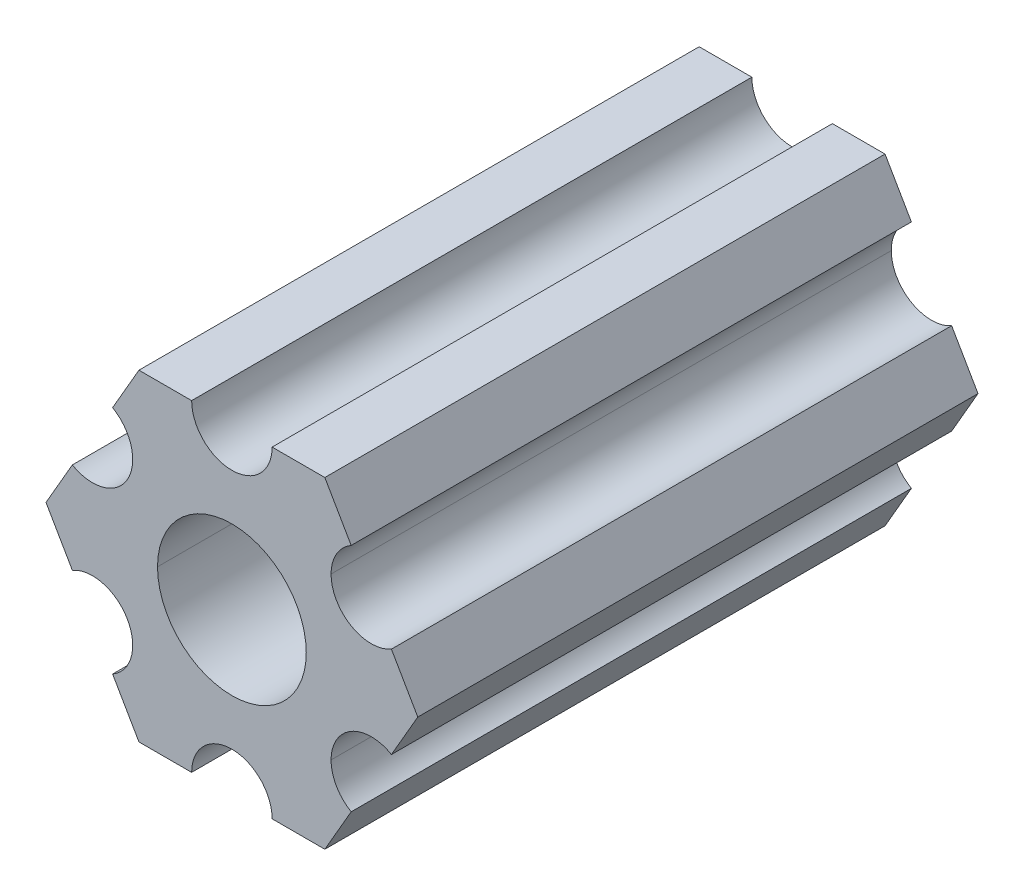
ISO-10303-21;
HEADER;
FILE_DESCRIPTION(('STEP AP214'),'2;1');
FILE_NAME('part.step','',(''),(''),'','','');
FILE_SCHEMA(('AUTOMOTIVE_DESIGN { 1 0 10303 214 1 1 1 1 }'));
ENDSEC;
DATA;
#1=APPLICATION_CONTEXT('core data for automotive mechanical design processes');
#2=APPLICATION_PROTOCOL_DEFINITION('international standard','automotive_design',2000,#1);
#3=PRODUCT_CONTEXT('',#1,'mechanical');
#4=PRODUCT('Part','Part','',(#3));
#5=PRODUCT_RELATED_PRODUCT_CATEGORY('part','',(#4));
#6=PRODUCT_DEFINITION_FORMATION('','',#4);
#7=PRODUCT_DEFINITION_CONTEXT('part definition',#1,'design');
#8=PRODUCT_DEFINITION('design','',#6,#7);
#9=PRODUCT_DEFINITION_SHAPE('','',#8);
#10=(LENGTH_UNIT() NAMED_UNIT(*) SI_UNIT(.MILLI.,.METRE.));
#11=(NAMED_UNIT(*) PLANE_ANGLE_UNIT() SI_UNIT($,.RADIAN.));
#12=(NAMED_UNIT(*) SI_UNIT($,.STERADIAN.) SOLID_ANGLE_UNIT());
#13=UNCERTAINTY_MEASURE_WITH_UNIT(LENGTH_MEASURE(1.E-05),#10,'distance_accuracy_value','');
#14=(GEOMETRIC_REPRESENTATION_CONTEXT(3) GLOBAL_UNCERTAINTY_ASSIGNED_CONTEXT((#13)) GLOBAL_UNIT_ASSIGNED_CONTEXT((#10,
#11,#12)) REPRESENTATION_CONTEXT('',''));
#15=CARTESIAN_POINT('',(0.,0.,0.));
#16=DIRECTION('',(0.,0.,1.));
#17=DIRECTION('',(1.,0.,0.));
#18=AXIS2_PLACEMENT_3D('',#15,#16,#17);
#19=CARTESIAN_POINT('',(6.29301142309098,-1.80018429024546,85.725));
#20=DIRECTION('',(-0.866025434075723,0.499999947533953,0.));
#21=DIRECTION('',(0.,0.,1.));
#22=AXIS2_PLACEMENT_3D('',#19,#20,#21);
#23=PLANE('',#22);
#24=DIRECTION('',(0.499999947533953,0.866025434075723,0.));
#25=VECTOR('',#24,1.);
#26=CARTESIAN_POINT('',(6.29301142309098,-1.80018429024546,22.098));
#27=LINE('',#26,#25);
#28=CARTESIAN_POINT('',(6.29301142309098,-1.80018429024546,22.098));
#29=VERTEX_POINT('',#28);
#30=CARTESIAN_POINT('',(7.33234841870826,4.44212519415746E-07,22.098));
#31=VERTEX_POINT('',#30);
#32=EDGE_CURVE('E398',#29,#31,#27,.T.);
#33=ORIENTED_EDGE('',*,*,#32,.F.);
#34=DIRECTION('',(0.,0.,-1.));
#35=VECTOR('',#34,1.);
#36=CARTESIAN_POINT('',(6.29301142309098,-1.80018429024546,85.725));
#37=LINE('',#36,#35);
#38=CARTESIAN_POINT('',(6.29301142309098,-1.80018429024546,0.));
#39=VERTEX_POINT('',#38);
#40=EDGE_CURVE('E270',#29,#39,#37,.T.);
#41=ORIENTED_EDGE('',*,*,#40,.T.);
#42=DIRECTION('',(0.499999947533953,0.866025434075723,0.));
#43=VECTOR('',#42,1.);
#44=CARTESIAN_POINT('',(6.29301142309098,-1.80018429024546,0.));
#45=LINE('',#44,#43);
#46=CARTESIAN_POINT('',(7.33234841870826,4.44212518961143E-07,0.));
#47=VERTEX_POINT('',#46);
#48=EDGE_CURVE('E292',#39,#47,#45,.T.);
#49=ORIENTED_EDGE('',*,*,#48,.T.);
#50=DIRECTION('',(0.,0.,1.));
#51=VECTOR('',#50,1.);
#52=CARTESIAN_POINT('',(7.33234841870827,4.44212519169686E-07,85.725));
#53=LINE('',#52,#51);
#54=EDGE_CURVE('E65',#47,#31,#53,.T.);
#55=ORIENTED_EDGE('',*,*,#54,.T.);
#56=EDGE_LOOP('',(#33,#41,#49,#55));
#57=FACE_BOUND('',#56,.T.);
#58=ADVANCED_FACE('F57',(#57),#23,.F.);
#59=CARTESIAN_POINT('',(7.33234841870827,4.44212519169686E-07,85.725));
#60=DIRECTION('',(-0.866025373493145,-0.500000052466057,0.));
#61=DIRECTION('',(-0.500000052466057,0.866025373493145,0.));
#62=AXIS2_PLACEMENT_3D('',#59,#60,#61);
#63=PLANE('',#62);
#64=DIRECTION('',(-0.500000052466057,0.866025373493145,0.));
#65=VECTOR('',#64,1.);
#66=CARTESIAN_POINT('',(7.33234841870827,4.44212519169686E-07,22.098));
#67=LINE('',#66,#65);
#68=CARTESIAN_POINT('',(6.29301120497139,1.80018505273895,22.098));
#69=VERTEX_POINT('',#68);
#70=EDGE_CURVE('E406',#31,#69,#67,.T.);
#71=ORIENTED_EDGE('',*,*,#70,.F.);
#72=ORIENTED_EDGE('',*,*,#54,.F.);
#73=DIRECTION('',(-0.500000052466057,0.866025373493145,0.));
#74=VECTOR('',#73,1.);
#75=CARTESIAN_POINT('',(7.33234841870827,4.44212519198906E-07,0.));
#76=LINE('',#75,#74);
#77=CARTESIAN_POINT('',(6.29301120497139,1.80018505273894,0.));
#78=VERTEX_POINT('',#77);
#79=EDGE_CURVE('E288',#47,#78,#76,.T.);
#80=ORIENTED_EDGE('',*,*,#79,.T.);
#81=DIRECTION('',(0.,0.,1.));
#82=VECTOR('',#81,1.);
#83=CARTESIAN_POINT('',(6.29301120497139,1.80018505273894,85.725));
#84=LINE('',#83,#82);
#85=EDGE_CURVE('E390',#78,#69,#84,.T.);
#86=ORIENTED_EDGE('',*,*,#85,.T.);
#87=EDGE_LOOP('',(#71,#72,#80,#86));
#88=FACE_BOUND('',#87,.T.);
#89=ADVANCED_FACE('F404',(#88),#63,.F.);
#90=CARTESIAN_POINT('',(5.49926112168156,3.17500033315934,85.725));
#91=DIRECTION('',(0.,0.,-1.));
#92=DIRECTION('',(-1.,0.,0.));
#93=AXIS2_PLACEMENT_3D('',#90,#91,#92);
#94=CYLINDRICAL_SURFACE('',#93,1.5875);
#95=CARTESIAN_POINT('',(5.49926112168156,3.17500033315934,22.098));
#96=DIRECTION('',(0.,0.,1.));
#97=DIRECTION('',(1.,0.,0.));
#98=AXIS2_PLACEMENT_3D('',#95,#96,#97);
#99=CIRCLE('',#98,1.5875);
#100=CARTESIAN_POINT('',(3.91176112168156,3.17500033315934,22.098));
#101=VERTEX_POINT('',#100);
#102=EDGE_CURVE('E409',#69,#101,#99,.F.);
#103=ORIENTED_EDGE('',*,*,#102,.F.);
#104=ORIENTED_EDGE('',*,*,#85,.F.);
#105=CARTESIAN_POINT('',(5.49926112168156,3.17500033315934,0.));
#106=DIRECTION('',(0.,0.,-1.));
#107=DIRECTION('',(-1.,0.,0.));
#108=AXIS2_PLACEMENT_3D('',#105,#106,#107);
#109=CIRCLE('',#108,1.5875);
#110=CARTESIAN_POINT('',(3.91176112168156,3.17500033315934,0.));
#111=VERTEX_POINT('',#110);
#112=EDGE_CURVE('E262',#78,#111,#109,.T.);
#113=ORIENTED_EDGE('',*,*,#112,.T.);
#114=DIRECTION('',(0.,0.,-1.));
#115=VECTOR('',#114,1.);
#116=CARTESIAN_POINT('',(3.91176112168156,3.17500033315934,85.725));
#117=LINE('',#116,#115);
#118=EDGE_CURVE('E273',#101,#111,#117,.T.);
#119=ORIENTED_EDGE('',*,*,#118,.F.);
#120=EDGE_LOOP('',(#103,#104,#113,#119));
#121=FACE_BOUND('',#120,.T.);
#122=ADVANCED_FACE('F869',(#121),#94,.F.);
#123=CARTESIAN_POINT('',(4.70551103839172,4.54981561357972,85.725));
#124=DIRECTION('',(-0.866025373493151,-0.500000052466046,0.));
#125=DIRECTION('',(-0.500000052466046,0.866025373493151,0.));
#126=AXIS2_PLACEMENT_3D('',#123,#124,#125);
#127=PLANE('',#126);
#128=DIRECTION('',(-0.500000052466046,0.866025373493151,0.));
#129=VECTOR('',#128,1.);
#130=CARTESIAN_POINT('',(4.70551103839172,4.54981561357972,22.098));
#131=LINE('',#130,#129);
#132=CARTESIAN_POINT('',(4.70551103839172,4.54981561357972,22.098));
#133=VERTEX_POINT('',#132);
#134=CARTESIAN_POINT('',(3.66617382465481,6.35000022210627,22.098));
#135=VERTEX_POINT('',#134);
#136=EDGE_CURVE('E479',#133,#135,#131,.T.);
#137=ORIENTED_EDGE('',*,*,#136,.F.);
#138=DIRECTION('',(0.,0.,1.));
#139=VECTOR('',#138,1.);
#140=CARTESIAN_POINT('',(4.70551103839172,4.54981561357972,85.725));
#141=LINE('',#140,#139);
#142=CARTESIAN_POINT('',(4.70551103839172,4.54981561357972,0.));
#143=VERTEX_POINT('',#142);
#144=EDGE_CURVE('E281',#143,#133,#141,.T.);
#145=ORIENTED_EDGE('',*,*,#144,.F.);
#146=DIRECTION('',(-0.500000052466046,0.866025373493151,0.));
#147=VECTOR('',#146,1.);
#148=CARTESIAN_POINT('',(4.70551103839172,4.54981561357972,0.));
#149=LINE('',#148,#147);
#150=CARTESIAN_POINT('',(3.66617382465481,6.35000022210627,0.));
#151=VERTEX_POINT('',#150);
#152=EDGE_CURVE('E259',#143,#151,#149,.T.);
#153=ORIENTED_EDGE('',*,*,#152,.T.);
#154=DIRECTION('',(0.,0.,1.));
#155=VECTOR('',#154,1.);
#156=CARTESIAN_POINT('',(3.66617382465481,6.35000022210627,85.725));
#157=LINE('',#156,#155);
#158=EDGE_CURVE('E386',#151,#135,#157,.T.);
#159=ORIENTED_EDGE('',*,*,#158,.T.);
#160=EDGE_LOOP('',(#137,#145,#153,#159));
#161=FACE_BOUND('',#160,.T.);
#162=ADVANCED_FACE('F491',(#161),#127,.F.);
#163=CARTESIAN_POINT('',(3.66617382465481,6.35000022210627,85.725));
#164=DIRECTION('',(6.05825850611185E-08,-1.,0.));
#165=DIRECTION('',(0.,0.,-1.));
#166=AXIS2_PLACEMENT_3D('',#163,#164,#165);
#167=PLANE('',#166);
#168=DIRECTION('',(-0.999999999999998,-6.05825850611184E-08,0.));
#169=VECTOR('',#168,1.);
#170=CARTESIAN_POINT('',(3.66617382465481,6.35000022210627,22.098));
#171=LINE('',#170,#169);
#172=CARTESIAN_POINT('',(1.58749961530074,6.35,22.098));
#173=VERTEX_POINT('',#172);
#174=EDGE_CURVE('E476',#135,#173,#171,.T.);
#175=ORIENTED_EDGE('',*,*,#174,.F.);
#176=ORIENTED_EDGE('',*,*,#158,.F.);
#177=DIRECTION('',(-1.,0.,0.));
#178=VECTOR('',#177,1.);
#179=CARTESIAN_POINT('',(5.49926112168156,6.35000022210627,0.));
#180=LINE('',#179,#178);
#181=CARTESIAN_POINT('',(1.58749961530073,6.35000015914054,0.));
#182=VERTEX_POINT('',#181);
#183=EDGE_CURVE('E263',#151,#182,#180,.T.);
#184=ORIENTED_EDGE('',*,*,#183,.T.);
#185=DIRECTION('',(0.,0.,1.));
#186=VECTOR('',#185,1.);
#187=CARTESIAN_POINT('',(1.58749961530074,6.35000009617482,85.725));
#188=LINE('',#187,#186);
#189=EDGE_CURVE('E303',#182,#173,#188,.T.);
#190=ORIENTED_EDGE('',*,*,#189,.T.);
#191=EDGE_LOOP('',(#175,#176,#184,#190));
#192=FACE_BOUND('',#191,.T.);
#193=ADVANCED_FACE('F498',(#192),#167,.F.);
#194=CARTESIAN_POINT('',(-3.84699260060323E-07,6.35,85.725));
#195=DIRECTION('',(0.,0.,-1.));
#196=DIRECTION('',(-1.,0.,0.));
#197=AXIS2_PLACEMENT_3D('',#194,#195,#196);
#198=CYLINDRICAL_SURFACE('',#197,1.5875);
#199=CARTESIAN_POINT('',(-3.84699260060323E-07,6.35,22.098));
#200=DIRECTION('',(0.,0.,1.));
#201=DIRECTION('',(1.,0.,0.));
#202=AXIS2_PLACEMENT_3D('',#199,#200,#201);
#203=CIRCLE('',#202,1.5875);
#204=CARTESIAN_POINT('',(-1.58750038469926,6.34999990382518,22.098));
#205=VERTEX_POINT('',#204);
#206=EDGE_CURVE('E473',#173,#205,#203,.F.);
#207=ORIENTED_EDGE('',*,*,#206,.F.);
#208=ORIENTED_EDGE('',*,*,#189,.F.);
#209=CARTESIAN_POINT('',(-3.84699260060323E-07,6.35,0.));
#210=DIRECTION('',(0.,0.,-1.));
#211=DIRECTION('',(-1.,0.,0.));
#212=AXIS2_PLACEMENT_3D('',#209,#210,#211);
#213=CIRCLE('',#212,1.5875);
#214=CARTESIAN_POINT('',(-1.58750038469926,6.34999990382519,0.));
#215=VERTEX_POINT('',#214);
#216=EDGE_CURVE('E329',#182,#215,#213,.T.);
#217=ORIENTED_EDGE('',*,*,#216,.T.);
#218=DIRECTION('',(0.,0.,1.));
#219=VECTOR('',#218,1.);
#220=CARTESIAN_POINT('',(-1.58750038469926,6.34999990382518,85.725));
#221=LINE('',#220,#219);
#222=EDGE_CURVE('E299',#215,#205,#221,.T.);
#223=ORIENTED_EDGE('',*,*,#222,.T.);
#224=EDGE_LOOP('',(#207,#208,#217,#223));
#225=FACE_BOUND('',#224,.T.);
#226=ADVANCED_FACE('F502',(#225),#198,.F.);
#227=CARTESIAN_POINT('',(-1.58750038469926,6.34999990382518,85.725));
#228=DIRECTION('',(6.05825963273174E-08,-1.,0.));
#229=DIRECTION('',(0.,0.,-1.));
#230=AXIS2_PLACEMENT_3D('',#227,#228,#229);
#231=PLANE('',#230);
#232=DIRECTION('',(-0.999999999999998,-6.05825963273173E-08,0.));
#233=VECTOR('',#232,1.);
#234=CARTESIAN_POINT('',(-1.58750038469926,6.34999990382518,22.098));
#235=LINE('',#234,#233);
#236=CARTESIAN_POINT('',(-3.66617454558244,6.34999986184803,22.098));
#237=VERTEX_POINT('',#236);
#238=EDGE_CURVE('E470',#205,#237,#235,.T.);
#239=ORIENTED_EDGE('',*,*,#238,.F.);
#240=ORIENTED_EDGE('',*,*,#222,.F.);
#241=DIRECTION('',(-1.,0.,0.));
#242=VECTOR('',#241,1.);
#243=CARTESIAN_POINT('',(5.49926112168156,6.34999990382519,0.));
#244=LINE('',#243,#242);
#245=CARTESIAN_POINT('',(-3.66617454558244,6.34999986184803,0.));
#246=VERTEX_POINT('',#245);
#247=EDGE_CURVE('E333',#215,#246,#244,.T.);
#248=ORIENTED_EDGE('',*,*,#247,.T.);
#249=DIRECTION('',(0.,0.,1.));
#250=VECTOR('',#249,1.);
#251=CARTESIAN_POINT('',(-3.66617459405349,6.3499997778937,85.725));
#252=LINE('',#251,#250);
#253=EDGE_CURVE('E286',#246,#237,#252,.T.);
#254=ORIENTED_EDGE('',*,*,#253,.T.);
#255=EDGE_LOOP('',(#239,#240,#248,#254));
#256=FACE_BOUND('',#255,.T.);
#257=ADVANCED_FACE('F504',(#256),#231,.F.);
#258=CARTESIAN_POINT('',(-3.66617459405349,6.3499997778937,85.725));
#259=DIRECTION('',(0.866025434075729,-0.499999947533942,0.));
#260=DIRECTION('',(0.,0.,-1.));
#261=AXIS2_PLACEMENT_3D('',#258,#259,#260);
#262=PLANE('',#261);
#263=DIRECTION('',(-0.499999947533942,-0.866025434075729,0.));
#264=VECTOR('',#263,1.);
#265=CARTESIAN_POINT('',(-3.66617459405349,6.3499997778937,22.098));
#266=LINE('',#265,#264);
#267=CARTESIAN_POINT('',(-4.70551158967065,4.54981504343587,22.098));
#268=VERTEX_POINT('',#267);
#269=EDGE_CURVE('E467',#237,#268,#266,.T.);
#270=ORIENTED_EDGE('',*,*,#269,.F.);
#271=ORIENTED_EDGE('',*,*,#253,.F.);
#272=DIRECTION('',(-0.499999947533943,-0.866025434075729,0.));
#273=VECTOR('',#272,1.);
#274=CARTESIAN_POINT('',(-3.66617459405349,6.3499997778937,0.));
#275=LINE('',#274,#273);
#276=CARTESIAN_POINT('',(-4.70551158967065,4.54981504343587,0.));
#277=VERTEX_POINT('',#276);
#278=EDGE_CURVE('E345',#246,#277,#275,.T.);
#279=ORIENTED_EDGE('',*,*,#278,.T.);
#280=DIRECTION('',(0.,0.,1.));
#281=VECTOR('',#280,1.);
#282=CARTESIAN_POINT('',(-4.70551158967065,4.54981504343587,85.725));
#283=LINE('',#282,#281);
#284=EDGE_CURVE('E282',#277,#268,#283,.T.);
#285=ORIENTED_EDGE('',*,*,#284,.T.);
#286=EDGE_LOOP('',(#270,#271,#279,#285));
#287=FACE_BOUND('',#286,.T.);
#288=ADVANCED_FACE('F509',(#287),#262,.F.);
#289=CARTESIAN_POINT('',(-5.49926150638082,3.17499966684067,85.725));
#290=DIRECTION('',(0.,0.,-1.));
#291=DIRECTION('',(-1.,0.,0.));
#292=AXIS2_PLACEMENT_3D('',#289,#290,#291);
#293=CYLINDRICAL_SURFACE('',#292,1.5875);
#294=CARTESIAN_POINT('',(-5.49926150638082,3.17499966684067,22.098));
#295=DIRECTION('',(0.,0.,1.));
#296=DIRECTION('',(1.,0.,0.));
#297=AXIS2_PLACEMENT_3D('',#294,#295,#296);
#298=CIRCLE('',#297,1.5875);
#299=CARTESIAN_POINT('',(-6.29301142309098,1.80018429024547,22.098));
#300=VERTEX_POINT('',#299);
#301=EDGE_CURVE('E464',#268,#300,#298,.F.);
#302=ORIENTED_EDGE('',*,*,#301,.F.);
#303=ORIENTED_EDGE('',*,*,#284,.F.);
#304=CARTESIAN_POINT('',(-5.49926150638082,3.17499966684067,0.));
#305=DIRECTION('',(0.,0.,-1.));
#306=DIRECTION('',(-1.,0.,0.));
#307=AXIS2_PLACEMENT_3D('',#304,#305,#306);
#308=CIRCLE('',#307,1.5875);
#309=CARTESIAN_POINT('',(-6.29301142309098,1.80018429024547,0.));
#310=VERTEX_POINT('',#309);
#311=EDGE_CURVE('E341',#277,#310,#308,.T.);
#312=ORIENTED_EDGE('',*,*,#311,.T.);
#313=DIRECTION('',(0.,0.,1.));
#314=VECTOR('',#313,1.);
#315=CARTESIAN_POINT('',(-6.29301142309098,1.80018429024547,85.725));
#316=LINE('',#315,#314);
#317=EDGE_CURVE('E287',#310,#300,#316,.T.);
#318=ORIENTED_EDGE('',*,*,#317,.T.);
#319=EDGE_LOOP('',(#302,#303,#312,#318));
#320=FACE_BOUND('',#319,.T.);
#321=ADVANCED_FACE('F512',(#320),#293,.F.);
#322=CARTESIAN_POINT('',(-6.29301142309098,1.80018429024547,85.725));
#323=DIRECTION('',(0.866025434075724,-0.499999947533952,0.));
#324=DIRECTION('',(0.,0.,-1.));
#325=AXIS2_PLACEMENT_3D('',#322,#323,#324);
#326=PLANE('',#325);
#327=DIRECTION('',(-0.499999947533952,-0.866025434075724,0.));
#328=VECTOR('',#327,1.);
#329=CARTESIAN_POINT('',(-6.29301142309098,1.80018429024547,22.098));
#330=LINE('',#329,#328);
#331=CARTESIAN_POINT('',(-7.33234841870827,-4.44212524036369E-07,22.098));
#332=VERTEX_POINT('',#331);
#333=EDGE_CURVE('E461',#300,#332,#330,.T.);
#334=ORIENTED_EDGE('',*,*,#333,.F.);
#335=ORIENTED_EDGE('',*,*,#317,.F.);
#336=DIRECTION('',(-0.499999947533952,-0.866025434075724,0.));
#337=VECTOR('',#336,1.);
#338=CARTESIAN_POINT('',(-6.29301142309098,1.80018429024547,0.));
#339=LINE('',#338,#337);
#340=CARTESIAN_POINT('',(-7.33234841870826,-4.44212524036367E-07,0.));
#341=VERTEX_POINT('',#340);
#342=EDGE_CURVE('E337',#310,#341,#339,.T.);
#343=ORIENTED_EDGE('',*,*,#342,.T.);
#344=DIRECTION('',(0.,0.,1.));
#345=VECTOR('',#344,1.);
#346=CARTESIAN_POINT('',(-7.33234841870827,-4.44212523790841E-07,85.725));
#347=LINE('',#346,#345);
#348=EDGE_CURVE('E269',#341,#332,#347,.T.);
#349=ORIENTED_EDGE('',*,*,#348,.T.);
#350=EDGE_LOOP('',(#334,#335,#343,#349));
#351=FACE_BOUND('',#350,.T.);
#352=ADVANCED_FACE('F517',(#351),#326,.F.);
#353=CARTESIAN_POINT('',(-7.33234841870827,-4.44212523790841E-07,85.725));
#354=DIRECTION('',(0.866025373493151,0.500000052466045,0.));
#355=DIRECTION('',(0.,0.,-1.));
#356=AXIS2_PLACEMENT_3D('',#353,#354,#355);
#357=PLANE('',#356);
#358=DIRECTION('',(0.500000052466045,-0.866025373493151,0.));
#359=VECTOR('',#358,1.);
#360=CARTESIAN_POINT('',(-7.33234841870827,-4.44212523790841E-07,22.098));
#361=LINE('',#360,#359);
#362=CARTESIAN_POINT('',(-6.29301120497141,-1.80018505273896,22.098));
#363=VERTEX_POINT('',#362);
#364=EDGE_CURVE('E458',#332,#363,#361,.T.);
#365=ORIENTED_EDGE('',*,*,#364,.F.);
#366=ORIENTED_EDGE('',*,*,#348,.F.);
#367=DIRECTION('',(0.500000052466045,-0.866025373493151,0.));
#368=VECTOR('',#367,1.);
#369=CARTESIAN_POINT('',(-7.33234841870827,-4.44212523969395E-07,0.));
#370=LINE('',#369,#368);
#371=CARTESIAN_POINT('',(-6.29301120497141,-1.80018505273897,0.));
#372=VERTEX_POINT('',#371);
#373=EDGE_CURVE('E308',#341,#372,#370,.T.);
#374=ORIENTED_EDGE('',*,*,#373,.T.);
#375=DIRECTION('',(0.,0.,1.));
#376=VECTOR('',#375,1.);
#377=CARTESIAN_POINT('',(-6.29301120497141,-1.80018505273897,85.725));
#378=LINE('',#377,#376);
#379=EDGE_CURVE('E265',#372,#363,#378,.T.);
#380=ORIENTED_EDGE('',*,*,#379,.T.);
#381=EDGE_LOOP('',(#365,#366,#374,#380));
#382=FACE_BOUND('',#381,.T.);
#383=ADVANCED_FACE('F520',(#382),#357,.F.);
#384=CARTESIAN_POINT('',(-5.49926112168156,-3.17500033315934,85.725));
#385=DIRECTION('',(0.,0.,-1.));
#386=DIRECTION('',(-1.,0.,0.));
#387=AXIS2_PLACEMENT_3D('',#384,#385,#386);
#388=CYLINDRICAL_SURFACE('',#387,1.5875);
#389=CARTESIAN_POINT('',(-5.49926112168156,-3.17500033315934,22.098));
#390=DIRECTION('',(0.,0.,1.));
#391=DIRECTION('',(1.,0.,0.));
#392=AXIS2_PLACEMENT_3D('',#389,#390,#391);
#393=CIRCLE('',#392,1.5875);
#394=CARTESIAN_POINT('',(-4.70551103839172,-4.54981561357972,22.098));
#395=VERTEX_POINT('',#394);
#396=EDGE_CURVE('E455',#363,#395,#393,.F.);
#397=ORIENTED_EDGE('',*,*,#396,.F.);
#398=ORIENTED_EDGE('',*,*,#379,.F.);
#399=CARTESIAN_POINT('',(-5.49926112168156,-3.17500033315934,0.));
#400=DIRECTION('',(0.,0.,-1.));
#401=DIRECTION('',(-1.,0.,0.));
#402=AXIS2_PLACEMENT_3D('',#399,#400,#401);
#403=CIRCLE('',#402,1.5875);
#404=CARTESIAN_POINT('',(-4.70551103839172,-4.54981561357972,0.));
#405=VERTEX_POINT('',#404);
#406=EDGE_CURVE('E304',#372,#405,#403,.T.);
#407=ORIENTED_EDGE('',*,*,#406,.T.);
#408=DIRECTION('',(0.,0.,1.));
#409=VECTOR('',#408,1.);
#410=CARTESIAN_POINT('',(-4.70551103839172,-4.54981561357972,85.725));
#411=LINE('',#410,#409);
#412=EDGE_CURVE('E252',#405,#395,#411,.T.);
#413=ORIENTED_EDGE('',*,*,#412,.T.);
#414=EDGE_LOOP('',(#397,#398,#407,#413));
#415=FACE_BOUND('',#414,.T.);
#416=ADVANCED_FACE('F526',(#415),#388,.F.);
#417=CARTESIAN_POINT('',(-4.70551103839172,-4.54981561357972,85.725));
#418=DIRECTION('',(0.866025373493152,0.500000052466045,0.));
#419=DIRECTION('',(0.,0.,-1.));
#420=AXIS2_PLACEMENT_3D('',#417,#418,#419);
#421=PLANE('',#420);
#422=DIRECTION('',(0.500000052466045,-0.866025373493152,0.));
#423=VECTOR('',#422,1.);
#424=CARTESIAN_POINT('',(-4.70551103839172,-4.54981561357972,22.098));
#425=LINE('',#424,#423);
#426=CARTESIAN_POINT('',(-3.66617382465481,-6.35000022210628,22.098));
#427=VERTEX_POINT('',#426);
#428=EDGE_CURVE('E452',#395,#427,#425,.T.);
#429=ORIENTED_EDGE('',*,*,#428,.F.);
#430=ORIENTED_EDGE('',*,*,#412,.F.);
#431=DIRECTION('',(0.500000052466045,-0.866025373493151,0.));
#432=VECTOR('',#431,1.);
#433=CARTESIAN_POINT('',(-4.70551103839172,-4.54981561357972,0.));
#434=LINE('',#433,#432);
#435=CARTESIAN_POINT('',(-3.66617382465481,-6.35000022210628,0.));
#436=VERTEX_POINT('',#435);
#437=EDGE_CURVE('E309',#405,#436,#434,.T.);
#438=ORIENTED_EDGE('',*,*,#437,.T.);
#439=DIRECTION('',(0.,0.,1.));
#440=VECTOR('',#439,1.);
#441=CARTESIAN_POINT('',(-3.66617382465481,-6.35000022210628,85.725));
#442=LINE('',#441,#440);
#443=EDGE_CURVE('E370',#436,#427,#442,.T.);
#444=ORIENTED_EDGE('',*,*,#443,.T.);
#445=EDGE_LOOP('',(#429,#430,#438,#444));
#446=FACE_BOUND('',#445,.T.);
#447=ADVANCED_FACE('F807',(#446),#421,.F.);
#448=CARTESIAN_POINT('',(-3.66617382465481,-6.35000022210628,85.725));
#449=DIRECTION('',(-6.05825854783851E-08,1.,0.));
#450=DIRECTION('',(0.,0.,1.));
#451=AXIS2_PLACEMENT_3D('',#448,#449,#450);
#452=PLANE('',#451);
#453=DIRECTION('',(0.999999999999998,6.0582585478385E-08,0.));
#454=VECTOR('',#453,1.);
#455=CARTESIAN_POINT('',(-3.66617382465481,-6.35000022210628,22.098));
#456=LINE('',#455,#454);
#457=CARTESIAN_POINT('',(-1.58749961530073,-6.35000011105314,22.098));
#458=VERTEX_POINT('',#457);
#459=EDGE_CURVE('E449',#427,#458,#456,.T.);
#460=ORIENTED_EDGE('',*,*,#459,.F.);
#461=ORIENTED_EDGE('',*,*,#443,.F.);
#462=DIRECTION('',(1.,0.,0.));
#463=VECTOR('',#462,1.);
#464=CARTESIAN_POINT('',(5.49926112168156,-6.35000022210628,0.));
#465=LINE('',#464,#463);
#466=CARTESIAN_POINT('',(-1.58749961530073,-6.35000011105314,0.));
#467=VERTEX_POINT('',#466);
#468=EDGE_CURVE('E322',#436,#467,#465,.T.);
#469=ORIENTED_EDGE('',*,*,#468,.T.);
#470=DIRECTION('',(0.,0.,1.));
#471=VECTOR('',#470,1.);
#472=CARTESIAN_POINT('',(-1.58749961530074,-6.35,85.725));
#473=LINE('',#472,#471);
#474=EDGE_CURVE('E369',#467,#458,#473,.T.);
#475=ORIENTED_EDGE('',*,*,#474,.T.);
#476=EDGE_LOOP('',(#460,#461,#469,#475));
#477=FACE_BOUND('',#476,.T.);
#478=ADVANCED_FACE('F799',(#477),#452,.F.);
#479=CARTESIAN_POINT('',(3.8469926204343E-07,-6.35,85.725));
#480=DIRECTION('',(0.,0.,-1.));
#481=DIRECTION('',(-1.,0.,0.));
#482=AXIS2_PLACEMENT_3D('',#479,#480,#481);
#483=CYLINDRICAL_SURFACE('',#482,1.5875);
#484=CARTESIAN_POINT('',(3.8469926204343E-07,-6.35,22.098));
#485=DIRECTION('',(0.,0.,1.));
#486=DIRECTION('',(1.,0.,0.));
#487=AXIS2_PLACEMENT_3D('',#484,#485,#486);
#488=CIRCLE('',#487,1.5875);
#489=CARTESIAN_POINT('',(1.58750038469926,-6.34999990382518,22.098));
#490=VERTEX_POINT('',#489);
#491=EDGE_CURVE('E446',#458,#490,#488,.F.);
#492=ORIENTED_EDGE('',*,*,#491,.F.);
#493=ORIENTED_EDGE('',*,*,#474,.F.);
#494=CARTESIAN_POINT('',(3.8469926204343E-07,-6.35,0.));
#495=DIRECTION('',(0.,0.,-1.));
#496=DIRECTION('',(-1.,0.,0.));
#497=AXIS2_PLACEMENT_3D('',#494,#495,#496);
#498=CIRCLE('',#497,1.5875);
#499=CARTESIAN_POINT('',(1.58750038469926,-6.34999990382519,0.));
#500=VERTEX_POINT('',#499);
#501=EDGE_CURVE('E257',#467,#500,#498,.T.);
#502=ORIENTED_EDGE('',*,*,#501,.T.);
#503=DIRECTION('',(0.,0.,1.));
#504=VECTOR('',#503,1.);
#505=CARTESIAN_POINT('',(1.58750038469926,-6.34999990382518,85.725));
#506=LINE('',#505,#504);
#507=EDGE_CURVE('E314',#500,#490,#506,.T.);
#508=ORIENTED_EDGE('',*,*,#507,.T.);
#509=EDGE_LOOP('',(#492,#493,#502,#508));
#510=FACE_BOUND('',#509,.T.);
#511=ADVANCED_FACE('F791',(#510),#483,.F.);
#512=CARTESIAN_POINT('',(1.58750038469926,-6.34999990382518,85.725));
#513=DIRECTION('',(-6.05825721258438E-08,1.,0.));
#514=DIRECTION('',(0.,0.,1.));
#515=AXIS2_PLACEMENT_3D('',#512,#513,#514);
#516=PLANE('',#515);
#517=DIRECTION('',(0.999999999999998,6.05825721258437E-08,0.));
#518=VECTOR('',#517,1.);
#519=CARTESIAN_POINT('',(1.58750038469926,-6.34999990382518,22.098));
#520=LINE('',#519,#518);
#521=CARTESIAN_POINT('',(3.66617454558243,-6.34999986184804,22.098));
#522=VERTEX_POINT('',#521);
#523=EDGE_CURVE('E443',#490,#522,#520,.T.);
#524=ORIENTED_EDGE('',*,*,#523,.F.);
#525=ORIENTED_EDGE('',*,*,#507,.F.);
#526=DIRECTION('',(1.,0.,0.));
#527=VECTOR('',#526,1.);
#528=CARTESIAN_POINT('',(5.49926112168156,-6.34999990382519,0.));
#529=LINE('',#528,#527);
#530=CARTESIAN_POINT('',(3.66617454558244,-6.34999986184804,0.));
#531=VERTEX_POINT('',#530);
#532=EDGE_CURVE('E253',#500,#531,#529,.T.);
#533=ORIENTED_EDGE('',*,*,#532,.T.);
#534=DIRECTION('',(0.,0.,1.));
#535=VECTOR('',#534,1.);
#536=CARTESIAN_POINT('',(3.66617459405346,-6.34999977789375,85.725));
#537=LINE('',#536,#535);
#538=EDGE_CURVE('E310',#531,#522,#537,.T.);
#539=ORIENTED_EDGE('',*,*,#538,.T.);
#540=EDGE_LOOP('',(#524,#525,#533,#539));
#541=FACE_BOUND('',#540,.T.);
#542=ADVANCED_FACE('F783',(#541),#516,.F.);
#543=CARTESIAN_POINT('',(3.66617459405346,-6.34999977789375,85.725));
#544=DIRECTION('',(-0.86602543407573,0.499999947533941,0.));
#545=DIRECTION('',(0.,0.,1.));
#546=AXIS2_PLACEMENT_3D('',#543,#544,#545);
#547=PLANE('',#546);
#548=DIRECTION('',(0.499999947533941,0.86602543407573,0.));
#549=VECTOR('',#548,1.);
#550=CARTESIAN_POINT('',(3.66617459405346,-6.34999977789375,22.098));
#551=LINE('',#550,#549);
#552=CARTESIAN_POINT('',(4.70551158967065,-4.54981504343587,22.098));
#553=VERTEX_POINT('',#552);
#554=EDGE_CURVE('E438',#522,#553,#551,.T.);
#555=ORIENTED_EDGE('',*,*,#554,.F.);
#556=ORIENTED_EDGE('',*,*,#538,.F.);
#557=DIRECTION('',(0.49999994753394,0.86602543407573,0.));
#558=VECTOR('',#557,1.);
#559=CARTESIAN_POINT('',(3.66617459405346,-6.34999977789376,0.));
#560=LINE('',#559,#558);
#561=CARTESIAN_POINT('',(4.70551158967065,-4.54981504343587,0.));
#562=VERTEX_POINT('',#561);
#563=EDGE_CURVE('E258',#531,#562,#560,.T.);
#564=ORIENTED_EDGE('',*,*,#563,.T.);
#565=DIRECTION('',(0.,0.,-1.));
#566=VECTOR('',#565,1.);
#567=CARTESIAN_POINT('',(4.70551158967065,-4.54981504343587,85.725));
#568=LINE('',#567,#566);
#569=EDGE_CURVE('E315',#553,#562,#568,.T.);
#570=ORIENTED_EDGE('',*,*,#569,.F.);
#571=EDGE_LOOP('',(#555,#556,#564,#570));
#572=FACE_BOUND('',#571,.T.);
#573=ADVANCED_FACE('F777',(#572),#547,.F.);
#574=CARTESIAN_POINT('',(5.49926150638082,-3.17499966684067,85.725));
#575=DIRECTION('',(0.,0.,-1.));
#576=DIRECTION('',(-1.,0.,0.));
#577=AXIS2_PLACEMENT_3D('',#574,#575,#576);
#578=CYLINDRICAL_SURFACE('',#577,1.5875);
#579=CARTESIAN_POINT('',(5.49926150638082,-3.17499966684067,22.098));
#580=DIRECTION('',(0.,0.,1.));
#581=DIRECTION('',(1.,0.,0.));
#582=AXIS2_PLACEMENT_3D('',#579,#580,#581);
#583=CIRCLE('',#582,1.5875);
#584=CARTESIAN_POINT('',(3.91176150638082,-3.17499966684067,22.098));
#585=VERTEX_POINT('',#584);
#586=EDGE_CURVE('E72',#553,#585,#583,.F.);
#587=ORIENTED_EDGE('',*,*,#586,.F.);
#588=ORIENTED_EDGE('',*,*,#569,.T.);
#589=CARTESIAN_POINT('',(5.49926150638082,-3.17499966684067,0.));
#590=DIRECTION('',(0.,0.,-1.));
#591=DIRECTION('',(-1.,0.,0.));
#592=AXIS2_PLACEMENT_3D('',#589,#590,#591);
#593=CIRCLE('',#592,1.5875);
#594=CARTESIAN_POINT('',(3.91176150638082,-3.17499966684067,0.));
#595=VERTEX_POINT('',#594);
#596=EDGE_CURVE('E280',#562,#595,#593,.T.);
#597=ORIENTED_EDGE('',*,*,#596,.T.);
#598=DIRECTION('',(0.,0.,-1.));
#599=VECTOR('',#598,1.);
#600=CARTESIAN_POINT('',(3.91176150638082,-3.17499966684067,85.725));
#601=LINE('',#600,#599);
#602=EDGE_CURVE('E242',#585,#595,#601,.T.);
#603=ORIENTED_EDGE('',*,*,#602,.F.);
#604=EDGE_LOOP('',(#587,#588,#597,#603));
#605=FACE_BOUND('',#604,.T.);
#606=ADVANCED_FACE('F428',(#605),#578,.F.);
#607=CARTESIAN_POINT('',(0.,0.,85.725));
#608=DIRECTION('',(0.,0.,-1.));
#609=DIRECTION('',(-1.,0.,0.));
#610=AXIS2_PLACEMENT_3D('',#607,#608,#609);
#611=CYLINDRICAL_SURFACE('',#610,2.9337);
#612=CARTESIAN_POINT('',(0.,0.,22.098));
#613=DIRECTION('',(0.,0.,1.));
#614=DIRECTION('',(1.,0.,0.));
#615=AXIS2_PLACEMENT_3D('',#612,#613,#614);
#616=CIRCLE('',#615,2.9337);
#617=CARTESIAN_POINT('',(-2.9337,0.,22.098));
#618=VERTEX_POINT('',#617);
#619=CARTESIAN_POINT('',(2.9337,0.,22.098));
#620=VERTEX_POINT('',#619);
#621=EDGE_CURVE('E78',#618,#620,#616,.F.);
#622=ORIENTED_EDGE('',*,*,#621,.F.);
#623=DIRECTION('',(0.,0.,-1.));
#624=VECTOR('',#623,1.);
#625=CARTESIAN_POINT('',(-2.9337,0.,85.725));
#626=LINE('',#625,#624);
#627=CARTESIAN_POINT('',(-2.9337,0.,0.));
#628=VERTEX_POINT('',#627);
#629=EDGE_CURVE('E231',#618,#628,#626,.T.);
#630=ORIENTED_EDGE('',*,*,#629,.T.);
#631=CARTESIAN_POINT('',(0.,0.,0.));
#632=DIRECTION('',(0.,0.,1.));
#633=DIRECTION('',(-1.,0.,0.));
#634=AXIS2_PLACEMENT_3D('',#631,#632,#633);
#635=CIRCLE('',#634,2.9337);
#636=CARTESIAN_POINT('',(2.9337,0.,0.));
#637=VERTEX_POINT('',#636);
#638=EDGE_CURVE('E277',#637,#628,#635,.T.);
#639=ORIENTED_EDGE('',*,*,#638,.F.);
#640=DIRECTION('',(0.,0.,-1.));
#641=VECTOR('',#640,1.);
#642=CARTESIAN_POINT('',(2.9337,0.,85.725));
#643=LINE('',#642,#641);
#644=EDGE_CURVE('E233',#620,#637,#643,.T.);
#645=ORIENTED_EDGE('',*,*,#644,.F.);
#646=EDGE_LOOP('',(#622,#630,#639,#645));
#647=FACE_BOUND('',#646,.T.);
#648=ADVANCED_FACE('F229',(#647),#611,.F.);
#649=CARTESIAN_POINT('',(5.49926112168156,3.17500033315934,85.725));
#650=DIRECTION('',(0.,0.,-1.));
#651=DIRECTION('',(-1.,0.,0.));
#652=AXIS2_PLACEMENT_3D('',#649,#650,#651);
#653=CYLINDRICAL_SURFACE('',#652,1.5875);
#654=CARTESIAN_POINT('',(5.49926112168156,3.17500033315934,22.098));
#655=DIRECTION('',(0.,0.,1.));
#656=DIRECTION('',(1.,0.,0.));
#657=AXIS2_PLACEMENT_3D('',#654,#655,#656);
#658=CIRCLE('',#657,1.5875);
#659=EDGE_CURVE('E414',#101,#133,#658,.F.);
#660=ORIENTED_EDGE('',*,*,#659,.F.);
#661=ORIENTED_EDGE('',*,*,#118,.T.);
#662=CARTESIAN_POINT('',(5.49926112168156,3.17500033315934,0.));
#663=DIRECTION('',(0.,0.,-1.));
#664=DIRECTION('',(-1.,0.,0.));
#665=AXIS2_PLACEMENT_3D('',#662,#663,#664);
#666=CIRCLE('',#665,1.5875);
#667=EDGE_CURVE('E276',#111,#143,#666,.T.);
#668=ORIENTED_EDGE('',*,*,#667,.T.);
#669=ORIENTED_EDGE('',*,*,#144,.T.);
#670=EDGE_LOOP('',(#660,#661,#668,#669));
#671=FACE_BOUND('',#670,.T.);
#672=ADVANCED_FACE('F492',(#671),#653,.F.);
#673=CARTESIAN_POINT('',(5.49926150638082,-3.17499966684067,85.725));
#674=DIRECTION('',(0.,0.,-1.));
#675=DIRECTION('',(-1.,0.,0.));
#676=AXIS2_PLACEMENT_3D('',#673,#674,#675);
#677=CYLINDRICAL_SURFACE('',#676,1.5875);
#678=CARTESIAN_POINT('',(5.49926150638082,-3.17499966684067,22.098));
#679=DIRECTION('',(0.,0.,1.));
#680=DIRECTION('',(1.,0.,0.));
#681=AXIS2_PLACEMENT_3D('',#678,#679,#680);
#682=CIRCLE('',#681,1.5875);
#683=EDGE_CURVE('E235',#585,#29,#682,.F.);
#684=ORIENTED_EDGE('',*,*,#683,.F.);
#685=ORIENTED_EDGE('',*,*,#602,.T.);
#686=CARTESIAN_POINT('',(5.49926150638082,-3.17499966684067,0.));
#687=DIRECTION('',(0.,0.,-1.));
#688=DIRECTION('',(-1.,0.,0.));
#689=AXIS2_PLACEMENT_3D('',#686,#687,#688);
#690=CIRCLE('',#689,1.5875);
#691=EDGE_CURVE('E247',#595,#39,#690,.T.);
#692=ORIENTED_EDGE('',*,*,#691,.T.);
#693=ORIENTED_EDGE('',*,*,#40,.F.);
#694=EDGE_LOOP('',(#684,#685,#692,#693));
#695=FACE_BOUND('',#694,.T.);
#696=ADVANCED_FACE('F434',(#695),#677,.F.);
#697=CARTESIAN_POINT('',(0.,0.,85.725));
#698=DIRECTION('',(0.,0.,-1.));
#699=DIRECTION('',(-1.,0.,0.));
#700=AXIS2_PLACEMENT_3D('',#697,#698,#699);
#701=CYLINDRICAL_SURFACE('',#700,2.9337);
#702=CARTESIAN_POINT('',(0.,0.,22.098));
#703=DIRECTION('',(0.,0.,1.));
#704=DIRECTION('',(1.,0.,0.));
#705=AXIS2_PLACEMENT_3D('',#702,#703,#704);
#706=CIRCLE('',#705,2.9337);
#707=EDGE_CURVE('E12',#620,#618,#706,.F.);
#708=ORIENTED_EDGE('',*,*,#707,.F.);
#709=ORIENTED_EDGE('',*,*,#644,.T.);
#710=CARTESIAN_POINT('',(0.,0.,0.));
#711=DIRECTION('',(0.,0.,1.));
#712=DIRECTION('',(-1.,0.,0.));
#713=AXIS2_PLACEMENT_3D('',#710,#711,#712);
#714=CIRCLE('',#713,2.9337);
#715=EDGE_CURVE('E240',#628,#637,#714,.T.);
#716=ORIENTED_EDGE('',*,*,#715,.F.);
#717=ORIENTED_EDGE('',*,*,#629,.F.);
#718=EDGE_LOOP('',(#708,#709,#716,#717));
#719=FACE_BOUND('',#718,.T.);
#720=ADVANCED_FACE('F238',(#719),#701,.F.);
#721=CARTESIAN_POINT('',(5.49926112168156,3.17500033315934,0.));
#722=DIRECTION('',(0.,0.,1.));
#723=DIRECTION('',(1.,0.,0.));
#724=AXIS2_PLACEMENT_3D('',#721,#722,#723);
#725=PLANE('',#724);
#726=ORIENTED_EDGE('',*,*,#715,.T.);
#727=ORIENTED_EDGE('',*,*,#638,.T.);
#728=EDGE_LOOP('',(#726,#727));
#729=FACE_BOUND('',#728,.T.);
#730=ORIENTED_EDGE('',*,*,#596,.F.);
#731=ORIENTED_EDGE('',*,*,#563,.F.);
#732=ORIENTED_EDGE('',*,*,#532,.F.);
#733=ORIENTED_EDGE('',*,*,#501,.F.);
#734=ORIENTED_EDGE('',*,*,#468,.F.);
#735=ORIENTED_EDGE('',*,*,#437,.F.);
#736=ORIENTED_EDGE('',*,*,#406,.F.);
#737=ORIENTED_EDGE('',*,*,#373,.F.);
#738=ORIENTED_EDGE('',*,*,#342,.F.);
#739=ORIENTED_EDGE('',*,*,#311,.F.);
#740=ORIENTED_EDGE('',*,*,#278,.F.);
#741=ORIENTED_EDGE('',*,*,#247,.F.);
#742=ORIENTED_EDGE('',*,*,#216,.F.);
#743=ORIENTED_EDGE('',*,*,#183,.F.);
#744=ORIENTED_EDGE('',*,*,#152,.F.);
#745=ORIENTED_EDGE('',*,*,#667,.F.);
#746=ORIENTED_EDGE('',*,*,#112,.F.);
#747=ORIENTED_EDGE('',*,*,#79,.F.);
#748=ORIENTED_EDGE('',*,*,#48,.F.);
#749=ORIENTED_EDGE('',*,*,#691,.F.);
#750=EDGE_LOOP('',(#730,#731,#732,#733,#734,#735,#736,#737,#738,#739,#740,#741,#742,#743,#744,
#745,#746,#747,#748,#749));
#751=FACE_BOUND('',#750,.T.);
#752=ADVANCED_FACE('F432',(#729,#751),#725,.F.);
#753=CARTESIAN_POINT('',(5.49926112168156,3.17500033315934,22.098));
#754=DIRECTION('',(0.,0.,1.));
#755=DIRECTION('',(1.,0.,0.));
#756=AXIS2_PLACEMENT_3D('',#753,#754,#755);
#757=PLANE('',#756);
#758=ORIENTED_EDGE('',*,*,#621,.T.);
#759=ORIENTED_EDGE('',*,*,#707,.T.);
#760=EDGE_LOOP('',(#758,#759));
#761=FACE_BOUND('',#760,.T.);
#762=ORIENTED_EDGE('',*,*,#70,.T.);
#763=ORIENTED_EDGE('',*,*,#102,.T.);
#764=ORIENTED_EDGE('',*,*,#659,.T.);
#765=ORIENTED_EDGE('',*,*,#136,.T.);
#766=ORIENTED_EDGE('',*,*,#174,.T.);
#767=ORIENTED_EDGE('',*,*,#206,.T.);
#768=ORIENTED_EDGE('',*,*,#238,.T.);
#769=ORIENTED_EDGE('',*,*,#269,.T.);
#770=ORIENTED_EDGE('',*,*,#301,.T.);
#771=ORIENTED_EDGE('',*,*,#333,.T.);
#772=ORIENTED_EDGE('',*,*,#364,.T.);
#773=ORIENTED_EDGE('',*,*,#396,.T.);
#774=ORIENTED_EDGE('',*,*,#428,.T.);
#775=ORIENTED_EDGE('',*,*,#459,.T.);
#776=ORIENTED_EDGE('',*,*,#491,.T.);
#777=ORIENTED_EDGE('',*,*,#523,.T.);
#778=ORIENTED_EDGE('',*,*,#554,.T.);
#779=ORIENTED_EDGE('',*,*,#586,.T.);
#780=ORIENTED_EDGE('',*,*,#683,.T.);
#781=ORIENTED_EDGE('',*,*,#32,.T.);
#782=EDGE_LOOP('',(#762,#763,#764,#765,#766,#767,#768,#769,#770,#771,#772,#773,#774,#775,#776,
#777,#778,#779,#780,#781));
#783=FACE_BOUND('',#782,.T.);
#784=ADVANCED_FACE('F224',(#761,#783),#757,.T.);
#785=CLOSED_SHELL('',(#58,#89,#122,#162,#193,#226,#257,#288,#321,#352,#383,#416,#447,#478,#511,
#542,#573,#606,#648,#672,#696,#720,#752,#784));
#786=MANIFOLD_SOLID_BREP('B2',#785);
#787=ADVANCED_BREP_SHAPE_REPRESENTATION('',(#18,#786),#14);
#788=SHAPE_DEFINITION_REPRESENTATION(#9,#787);
ENDSEC;
END-ISO-10303-21;
